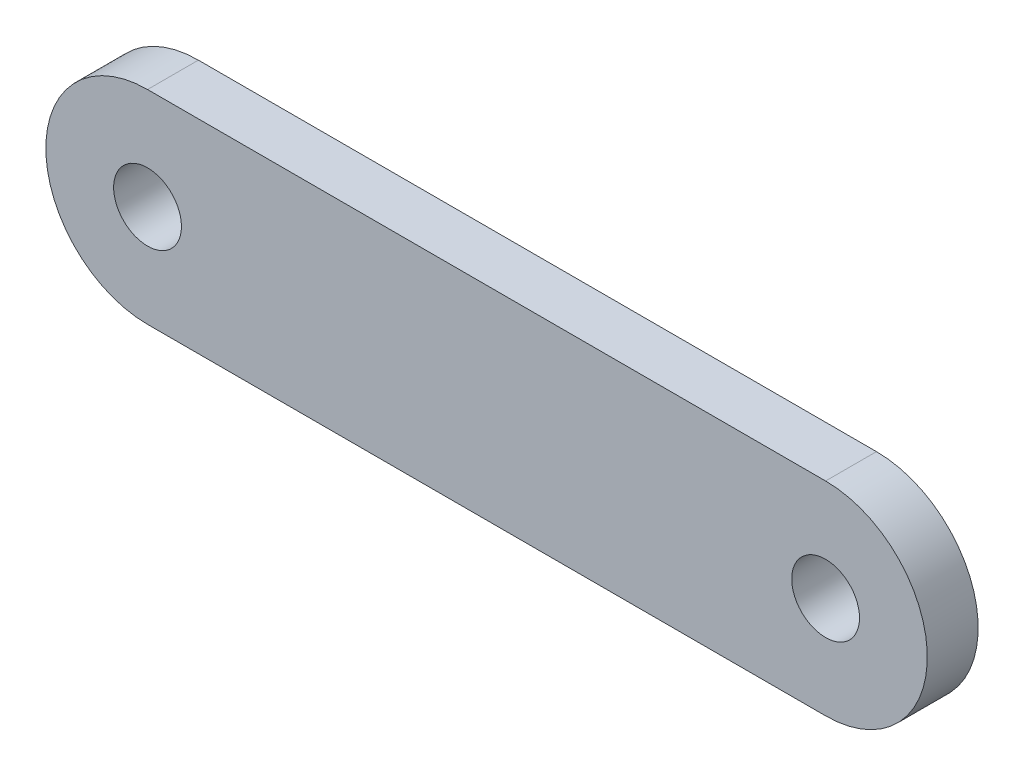
ISO-10303-21;
HEADER;
FILE_DESCRIPTION(('STEP AP214'),'2;1');
FILE_NAME('part.step','',(''),(''),'','','');
FILE_SCHEMA(('AUTOMOTIVE_DESIGN { 1 0 10303 214 1 1 1 1 }'));
ENDSEC;
DATA;
#1=APPLICATION_CONTEXT('core data for automotive mechanical design processes');
#2=APPLICATION_PROTOCOL_DEFINITION('international standard','automotive_design',2000,#1);
#3=PRODUCT_CONTEXT('',#1,'mechanical');
#4=PRODUCT('Part','Part','',(#3));
#5=PRODUCT_RELATED_PRODUCT_CATEGORY('part','',(#4));
#6=PRODUCT_DEFINITION_FORMATION('','',#4);
#7=PRODUCT_DEFINITION_CONTEXT('part definition',#1,'design');
#8=PRODUCT_DEFINITION('design','',#6,#7);
#9=PRODUCT_DEFINITION_SHAPE('','',#8);
#10=(LENGTH_UNIT() NAMED_UNIT(*) SI_UNIT(.MILLI.,.METRE.));
#11=(NAMED_UNIT(*) PLANE_ANGLE_UNIT() SI_UNIT($,.RADIAN.));
#12=(NAMED_UNIT(*) SI_UNIT($,.STERADIAN.) SOLID_ANGLE_UNIT());
#13=UNCERTAINTY_MEASURE_WITH_UNIT(LENGTH_MEASURE(1.E-05),#10,'distance_accuracy_value','');
#14=(GEOMETRIC_REPRESENTATION_CONTEXT(3) GLOBAL_UNCERTAINTY_ASSIGNED_CONTEXT((#13)) GLOBAL_UNIT_ASSIGNED_CONTEXT((#10,
#11,#12)) REPRESENTATION_CONTEXT('',''));
#15=CARTESIAN_POINT('',(0.,0.,0.));
#16=DIRECTION('',(0.,0.,1.));
#17=DIRECTION('',(1.,0.,0.));
#18=AXIS2_PLACEMENT_3D('',#15,#16,#17);
#19=CARTESIAN_POINT('',(-35.3127241673783,0.,3.));
#20=DIRECTION('',(0.,0.,1.));
#21=DIRECTION('',(1.,0.,0.));
#22=AXIS2_PLACEMENT_3D('',#19,#20,#21);
#23=PLANE('',#22);
#24=CARTESIAN_POINT('',(-35.3127241673783,0.,3.));
#25=DIRECTION('',(0.,0.,1.));
#26=DIRECTION('',(1.,0.,0.));
#27=AXIS2_PLACEMENT_3D('',#24,#25,#26);
#28=CIRCLE('',#27,2.);
#29=CARTESIAN_POINT('',(-33.3127241673783,0.,3.));
#30=VERTEX_POINT('',#29);
#31=EDGE_CURVE('E100',#30,#30,#28,.T.);
#32=ORIENTED_EDGE('',*,*,#31,.F.);
#33=EDGE_LOOP('',(#32));
#34=FACE_BOUND('',#33,.T.);
#35=CARTESIAN_POINT('',(-35.3127241673783,0.,3.));
#36=DIRECTION('',(0.,0.,1.));
#37=DIRECTION('',(1.,0.,0.));
#38=AXIS2_PLACEMENT_3D('',#35,#36,#37);
#39=CIRCLE('',#38,6.);
#40=CARTESIAN_POINT('',(-35.3127241673783,6.,3.));
#41=VERTEX_POINT('',#40);
#42=CARTESIAN_POINT('',(-35.3127241673783,-6.,3.));
#43=VERTEX_POINT('',#42);
#44=EDGE_CURVE('E85',#41,#43,#39,.T.);
#45=ORIENTED_EDGE('',*,*,#44,.T.);
#46=DIRECTION('',(1.,0.,0.));
#47=VECTOR('',#46,1.);
#48=CARTESIAN_POINT('',(-35.3127241673783,-6.,3.));
#49=LINE('',#48,#47);
#50=CARTESIAN_POINT('',(4.68727583262171,-6.,3.));
#51=VERTEX_POINT('',#50);
#52=EDGE_CURVE('E80',#43,#51,#49,.T.);
#53=ORIENTED_EDGE('',*,*,#52,.T.);
#54=CARTESIAN_POINT('',(4.68727583262171,0.,3.));
#55=DIRECTION('',(0.,0.,1.));
#56=DIRECTION('',(1.,0.,0.));
#57=AXIS2_PLACEMENT_3D('',#54,#55,#56);
#58=CIRCLE('',#57,6.);
#59=CARTESIAN_POINT('',(4.68727583262171,6.,3.));
#60=VERTEX_POINT('',#59);
#61=EDGE_CURVE('E83',#51,#60,#58,.T.);
#62=ORIENTED_EDGE('',*,*,#61,.T.);
#63=DIRECTION('',(-1.,0.,0.));
#64=VECTOR('',#63,1.);
#65=CARTESIAN_POINT('',(-35.3127241673783,6.,3.));
#66=LINE('',#65,#64);
#67=EDGE_CURVE('E50',#60,#41,#66,.T.);
#68=ORIENTED_EDGE('',*,*,#67,.T.);
#69=EDGE_LOOP('',(#45,#53,#62,#68));
#70=FACE_BOUND('',#69,.T.);
#71=CARTESIAN_POINT('',(4.68727583262171,0.,3.));
#72=DIRECTION('',(0.,0.,1.));
#73=DIRECTION('',(1.,0.,0.));
#74=AXIS2_PLACEMENT_3D('',#71,#72,#73);
#75=CIRCLE('',#74,2.);
#76=CARTESIAN_POINT('',(6.68727583262171,0.,3.));
#77=VERTEX_POINT('',#76);
#78=EDGE_CURVE('E115',#77,#77,#75,.T.);
#79=ORIENTED_EDGE('',*,*,#78,.F.);
#80=EDGE_LOOP('',(#79));
#81=FACE_BOUND('',#80,.T.);
#82=ADVANCED_FACE('F33',(#34,#70,#81),#23,.T.);
#83=CARTESIAN_POINT('',(-35.3127241673783,0.,0.));
#84=DIRECTION('',(0.,0.,1.));
#85=DIRECTION('',(1.,0.,0.));
#86=AXIS2_PLACEMENT_3D('',#83,#84,#85);
#87=PLANE('',#86);
#88=CARTESIAN_POINT('',(-35.3127241673783,0.,0.));
#89=DIRECTION('',(0.,0.,1.));
#90=DIRECTION('',(1.,0.,0.));
#91=AXIS2_PLACEMENT_3D('',#88,#89,#90);
#92=CIRCLE('',#91,2.);
#93=CARTESIAN_POINT('',(-33.3127241673783,0.,0.));
#94=VERTEX_POINT('',#93);
#95=EDGE_CURVE('E112',#94,#94,#92,.T.);
#96=ORIENTED_EDGE('',*,*,#95,.T.);
#97=EDGE_LOOP('',(#96));
#98=FACE_BOUND('',#97,.T.);
#99=CARTESIAN_POINT('',(-35.3127241673783,0.,0.));
#100=DIRECTION('',(0.,0.,1.));
#101=DIRECTION('',(1.,0.,0.));
#102=AXIS2_PLACEMENT_3D('',#99,#100,#101);
#103=CIRCLE('',#102,6.);
#104=CARTESIAN_POINT('',(-35.3127241673783,6.,0.));
#105=VERTEX_POINT('',#104);
#106=CARTESIAN_POINT('',(-35.3127241673783,-6.,0.));
#107=VERTEX_POINT('',#106);
#108=EDGE_CURVE('E97',#105,#107,#103,.T.);
#109=ORIENTED_EDGE('',*,*,#108,.F.);
#110=DIRECTION('',(-1.,0.,0.));
#111=VECTOR('',#110,1.);
#112=CARTESIAN_POINT('',(-35.3127241673783,6.,0.));
#113=LINE('',#112,#111);
#114=CARTESIAN_POINT('',(4.68727583262171,6.,0.));
#115=VERTEX_POINT('',#114);
#116=EDGE_CURVE('E73',#115,#105,#113,.T.);
#117=ORIENTED_EDGE('',*,*,#116,.F.);
#118=CARTESIAN_POINT('',(4.68727583262171,0.,0.));
#119=DIRECTION('',(0.,0.,1.));
#120=DIRECTION('',(1.,0.,0.));
#121=AXIS2_PLACEMENT_3D('',#118,#119,#120);
#122=CIRCLE('',#121,6.);
#123=CARTESIAN_POINT('',(4.68727583262171,-6.,0.));
#124=VERTEX_POINT('',#123);
#125=EDGE_CURVE('E67',#124,#115,#122,.T.);
#126=ORIENTED_EDGE('',*,*,#125,.F.);
#127=DIRECTION('',(1.,0.,0.));
#128=VECTOR('',#127,1.);
#129=CARTESIAN_POINT('',(-35.3127241673783,-6.,0.));
#130=LINE('',#129,#128);
#131=EDGE_CURVE('E89',#107,#124,#130,.T.);
#132=ORIENTED_EDGE('',*,*,#131,.F.);
#133=EDGE_LOOP('',(#109,#117,#126,#132));
#134=FACE_BOUND('',#133,.T.);
#135=CARTESIAN_POINT('',(4.68727583262171,0.,0.));
#136=DIRECTION('',(0.,0.,1.));
#137=DIRECTION('',(1.,0.,0.));
#138=AXIS2_PLACEMENT_3D('',#135,#136,#137);
#139=CIRCLE('',#138,2.);
#140=CARTESIAN_POINT('',(6.68727583262171,0.,0.));
#141=VERTEX_POINT('',#140);
#142=EDGE_CURVE('E118',#141,#141,#139,.T.);
#143=ORIENTED_EDGE('',*,*,#142,.T.);
#144=EDGE_LOOP('',(#143));
#145=FACE_BOUND('',#144,.T.);
#146=ADVANCED_FACE('F108',(#98,#134,#145),#87,.F.);
#147=CARTESIAN_POINT('',(-35.3127241673783,0.,3.));
#148=DIRECTION('',(0.,0.,-1.));
#149=DIRECTION('',(-1.,0.,0.));
#150=AXIS2_PLACEMENT_3D('',#147,#148,#149);
#151=CYLINDRICAL_SURFACE('',#150,6.);
#152=ORIENTED_EDGE('',*,*,#108,.T.);
#153=DIRECTION('',(0.,0.,-1.));
#154=VECTOR('',#153,1.);
#155=CARTESIAN_POINT('',(-35.3127241673783,-6.,3.));
#156=LINE('',#155,#154);
#157=EDGE_CURVE('E11',#43,#107,#156,.T.);
#158=ORIENTED_EDGE('',*,*,#157,.F.);
#159=ORIENTED_EDGE('',*,*,#44,.F.);
#160=DIRECTION('',(0.,0.,-1.));
#161=VECTOR('',#160,1.);
#162=CARTESIAN_POINT('',(-35.3127241673783,6.,3.));
#163=LINE('',#162,#161);
#164=EDGE_CURVE('E93',#41,#105,#163,.T.);
#165=ORIENTED_EDGE('',*,*,#164,.T.);
#166=EDGE_LOOP('',(#152,#158,#159,#165));
#167=FACE_BOUND('',#166,.T.);
#168=ADVANCED_FACE('F35',(#167),#151,.T.);
#169=CARTESIAN_POINT('',(-35.3127241673783,-6.,3.));
#170=DIRECTION('',(0.,1.,0.));
#171=DIRECTION('',(0.,0.,1.));
#172=AXIS2_PLACEMENT_3D('',#169,#170,#171);
#173=PLANE('',#172);
#174=ORIENTED_EDGE('',*,*,#131,.T.);
#175=DIRECTION('',(0.,0.,-1.));
#176=VECTOR('',#175,1.);
#177=CARTESIAN_POINT('',(4.68727583262171,-6.,3.));
#178=LINE('',#177,#176);
#179=EDGE_CURVE('E42',#51,#124,#178,.T.);
#180=ORIENTED_EDGE('',*,*,#179,.F.);
#181=ORIENTED_EDGE('',*,*,#52,.F.);
#182=ORIENTED_EDGE('',*,*,#157,.T.);
#183=EDGE_LOOP('',(#174,#180,#181,#182));
#184=FACE_BOUND('',#183,.T.);
#185=ADVANCED_FACE('F88',(#184),#173,.F.);
#186=CARTESIAN_POINT('',(4.68727583262171,0.,3.));
#187=DIRECTION('',(0.,0.,-1.));
#188=DIRECTION('',(-1.,0.,0.));
#189=AXIS2_PLACEMENT_3D('',#186,#187,#188);
#190=CYLINDRICAL_SURFACE('',#189,6.);
#191=ORIENTED_EDGE('',*,*,#125,.T.);
#192=DIRECTION('',(0.,0.,-1.));
#193=VECTOR('',#192,1.);
#194=CARTESIAN_POINT('',(4.68727583262171,6.,3.));
#195=LINE('',#194,#193);
#196=EDGE_CURVE('E90',#60,#115,#195,.T.);
#197=ORIENTED_EDGE('',*,*,#196,.F.);
#198=ORIENTED_EDGE('',*,*,#61,.F.);
#199=ORIENTED_EDGE('',*,*,#179,.T.);
#200=EDGE_LOOP('',(#191,#197,#198,#199));
#201=FACE_BOUND('',#200,.T.);
#202=ADVANCED_FACE('F91',(#201),#190,.T.);
#203=CARTESIAN_POINT('',(-35.3127241673783,6.,3.));
#204=DIRECTION('',(0.,-1.,0.));
#205=DIRECTION('',(0.,0.,-1.));
#206=AXIS2_PLACEMENT_3D('',#203,#204,#205);
#207=PLANE('',#206);
#208=ORIENTED_EDGE('',*,*,#116,.T.);
#209=ORIENTED_EDGE('',*,*,#164,.F.);
#210=ORIENTED_EDGE('',*,*,#67,.F.);
#211=ORIENTED_EDGE('',*,*,#196,.T.);
#212=EDGE_LOOP('',(#208,#209,#210,#211));
#213=FACE_BOUND('',#212,.T.);
#214=ADVANCED_FACE('F105',(#213),#207,.F.);
#215=CARTESIAN_POINT('',(-35.3127241673783,0.,3.));
#216=DIRECTION('',(0.,0.,-1.));
#217=DIRECTION('',(-1.,0.,0.));
#218=AXIS2_PLACEMENT_3D('',#215,#216,#217);
#219=CYLINDRICAL_SURFACE('',#218,2.);
#220=ORIENTED_EDGE('',*,*,#31,.T.);
#221=EDGE_LOOP('',(#220));
#222=FACE_BOUND('',#221,.T.);
#223=ORIENTED_EDGE('',*,*,#95,.F.);
#224=EDGE_LOOP('',(#223));
#225=FACE_BOUND('',#224,.T.);
#226=ADVANCED_FACE('F136',(#222,#225),#219,.F.);
#227=CARTESIAN_POINT('',(4.68727583262171,0.,3.));
#228=DIRECTION('',(0.,0.,-1.));
#229=DIRECTION('',(-1.,0.,0.));
#230=AXIS2_PLACEMENT_3D('',#227,#228,#229);
#231=CYLINDRICAL_SURFACE('',#230,2.);
#232=ORIENTED_EDGE('',*,*,#78,.T.);
#233=EDGE_LOOP('',(#232));
#234=FACE_BOUND('',#233,.T.);
#235=ORIENTED_EDGE('',*,*,#142,.F.);
#236=EDGE_LOOP('',(#235));
#237=FACE_BOUND('',#236,.T.);
#238=ADVANCED_FACE('F124',(#234,#237),#231,.F.);
#239=CLOSED_SHELL('',(#82,#146,#168,#185,#202,#214,#226,#238));
#240=MANIFOLD_SOLID_BREP('B2',#239);
#241=ADVANCED_BREP_SHAPE_REPRESENTATION('',(#18,#240),#14);
#242=SHAPE_DEFINITION_REPRESENTATION(#9,#241);
ENDSEC;
END-ISO-10303-21;
